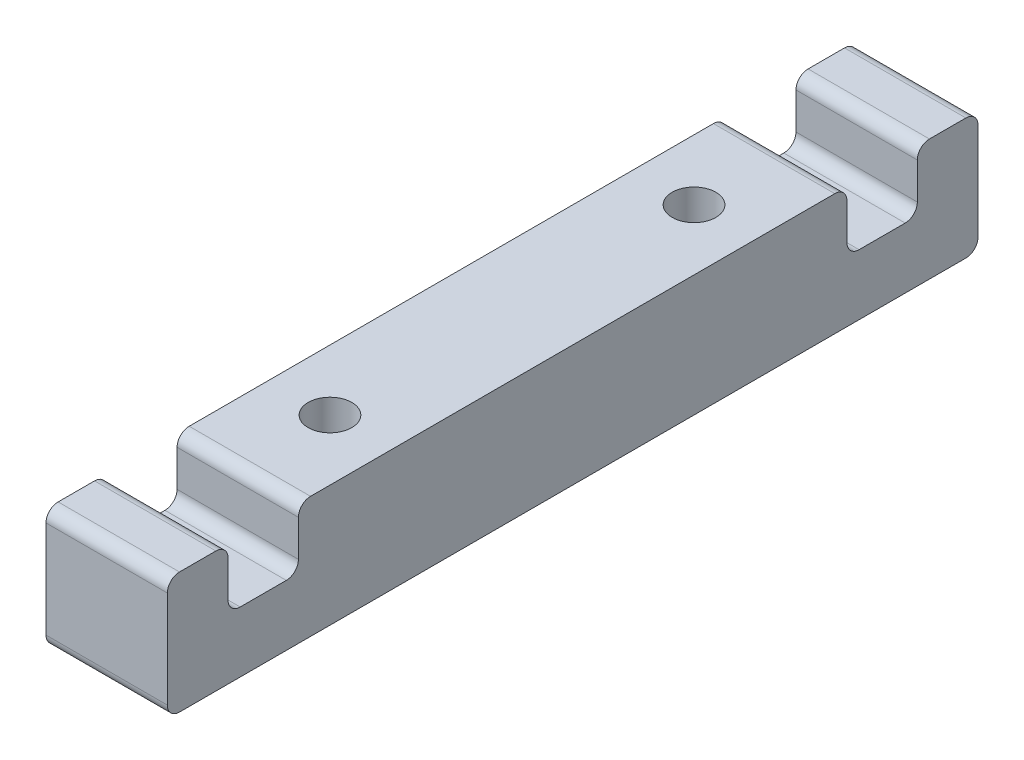
ISO-10303-21;
HEADER;
FILE_DESCRIPTION(('STEP AP214'),'2;1');
FILE_NAME('part.step','',(''),(''),'','','');
FILE_SCHEMA(('AUTOMOTIVE_DESIGN { 1 0 10303 214 1 1 1 1 }'));
ENDSEC;
DATA;
#1=APPLICATION_CONTEXT('core data for automotive mechanical design processes');
#2=APPLICATION_PROTOCOL_DEFINITION('international standard','automotive_design',2000,#1);
#3=PRODUCT_CONTEXT('',#1,'mechanical');
#4=PRODUCT('Part','Part','',(#3));
#5=PRODUCT_RELATED_PRODUCT_CATEGORY('part','',(#4));
#6=PRODUCT_DEFINITION_FORMATION('','',#4);
#7=PRODUCT_DEFINITION_CONTEXT('part definition',#1,'design');
#8=PRODUCT_DEFINITION('design','',#6,#7);
#9=PRODUCT_DEFINITION_SHAPE('','',#8);
#10=(LENGTH_UNIT() NAMED_UNIT(*) SI_UNIT(.MILLI.,.METRE.));
#11=(NAMED_UNIT(*) PLANE_ANGLE_UNIT() SI_UNIT($,.RADIAN.));
#12=(NAMED_UNIT(*) SI_UNIT($,.STERADIAN.) SOLID_ANGLE_UNIT());
#13=UNCERTAINTY_MEASURE_WITH_UNIT(LENGTH_MEASURE(1.E-05),#10,'distance_accuracy_value','');
#14=(GEOMETRIC_REPRESENTATION_CONTEXT(3) GLOBAL_UNCERTAINTY_ASSIGNED_CONTEXT((#13)) GLOBAL_UNIT_ASSIGNED_CONTEXT((#10,
#11,#12)) REPRESENTATION_CONTEXT('',''));
#15=CARTESIAN_POINT('',(0.,0.,0.));
#16=DIRECTION('',(0.,0.,1.));
#17=DIRECTION('',(1.,0.,0.));
#18=AXIS2_PLACEMENT_3D('',#15,#16,#17);
#19=CARTESIAN_POINT('',(12.7,0.,42.418));
#20=DIRECTION('',(0.,0.,-1.));
#21=DIRECTION('',(0.,1.,0.));
#22=AXIS2_PLACEMENT_3D('',#19,#20,#21);
#23=PLANE('',#22);
#24=DIRECTION('',(0.,-1.,0.));
#25=VECTOR('',#24,1.);
#26=CARTESIAN_POINT('',(12.7,0.,42.418));
#27=LINE('',#26,#25);
#28=CARTESIAN_POINT('',(12.7,11.43,42.418));
#29=VERTEX_POINT('',#28);
#30=CARTESIAN_POINT('',(12.7,1.26999999999999,42.418));
#31=VERTEX_POINT('',#30);
#32=EDGE_CURVE('E250',#29,#31,#27,.T.);
#33=ORIENTED_EDGE('',*,*,#32,.F.);
#34=DIRECTION('',(-1.,0.,0.));
#35=VECTOR('',#34,1.);
#36=CARTESIAN_POINT('',(12.7,11.43,42.418));
#37=LINE('',#36,#35);
#38=CARTESIAN_POINT('',(0.,11.43,42.418));
#39=VERTEX_POINT('',#38);
#40=EDGE_CURVE('E350',#29,#39,#37,.T.);
#41=ORIENTED_EDGE('',*,*,#40,.T.);
#42=DIRECTION('',(0.,-1.,0.));
#43=VECTOR('',#42,1.);
#44=CARTESIAN_POINT('',(0.,0.,42.418));
#45=LINE('',#44,#43);
#46=CARTESIAN_POINT('',(0.,1.26999999999999,42.418));
#47=VERTEX_POINT('',#46);
#48=EDGE_CURVE('E441',#39,#47,#45,.T.);
#49=ORIENTED_EDGE('',*,*,#48,.T.);
#50=DIRECTION('',(-1.,0.,0.));
#51=VECTOR('',#50,1.);
#52=CARTESIAN_POINT('',(12.7,1.26999999999999,42.418));
#53=LINE('',#52,#51);
#54=EDGE_CURVE('E347',#47,#31,#53,.F.);
#55=ORIENTED_EDGE('',*,*,#54,.T.);
#56=EDGE_LOOP('',(#33,#41,#49,#55));
#57=FACE_BOUND('',#56,.T.);
#58=ADVANCED_FACE('F42',(#57),#23,.F.);
#59=CARTESIAN_POINT('',(12.7,0.,-42.418));
#60=DIRECTION('',(0.,1.,0.));
#61=DIRECTION('',(0.,0.,1.));
#62=AXIS2_PLACEMENT_3D('',#59,#60,#61);
#63=PLANE('',#62);
#64=CARTESIAN_POINT('',(6.35,0.,19.05));
#65=DIRECTION('',(0.,1.,0.));
#66=DIRECTION('',(0.,0.,1.));
#67=AXIS2_PLACEMENT_3D('',#64,#65,#66);
#68=CIRCLE('',#67,2.286);
#69=CARTESIAN_POINT('',(6.35,0.,21.336));
#70=VERTEX_POINT('',#69);
#71=EDGE_CURVE('E446',#70,#70,#68,.T.);
#72=ORIENTED_EDGE('',*,*,#71,.T.);
#73=EDGE_LOOP('',(#72));
#74=FACE_BOUND('',#73,.T.);
#75=CARTESIAN_POINT('',(6.34999999999997,0.,-19.05));
#76=DIRECTION('',(0.,1.,0.));
#77=DIRECTION('',(0.,0.,-1.));
#78=AXIS2_PLACEMENT_3D('',#75,#76,#77);
#79=CIRCLE('',#78,2.286);
#80=CARTESIAN_POINT('',(6.34999999999997,0.,-16.764));
#81=VERTEX_POINT('',#80);
#82=EDGE_CURVE('E565',#81,#81,#79,.T.);
#83=ORIENTED_EDGE('',*,*,#82,.T.);
#84=EDGE_LOOP('',(#83));
#85=FACE_BOUND('',#84,.T.);
#86=DIRECTION('',(0.,0.,-1.));
#87=VECTOR('',#86,1.);
#88=CARTESIAN_POINT('',(12.7,0.,-42.418));
#89=LINE('',#88,#87);
#90=CARTESIAN_POINT('',(12.7,0.,41.148));
#91=VERTEX_POINT('',#90);
#92=CARTESIAN_POINT('',(12.7,0.,-41.148));
#93=VERTEX_POINT('',#92);
#94=EDGE_CURVE('E556',#91,#93,#89,.T.);
#95=ORIENTED_EDGE('',*,*,#94,.F.);
#96=DIRECTION('',(-1.,0.,0.));
#97=VECTOR('',#96,1.);
#98=CARTESIAN_POINT('',(12.7,0.,41.148));
#99=LINE('',#98,#97);
#100=CARTESIAN_POINT('',(0.,0.,41.148));
#101=VERTEX_POINT('',#100);
#102=EDGE_CURVE('E357',#91,#101,#99,.T.);
#103=ORIENTED_EDGE('',*,*,#102,.T.);
#104=DIRECTION('',(0.,0.,-1.));
#105=VECTOR('',#104,1.);
#106=CARTESIAN_POINT('',(0.,0.,-42.418));
#107=LINE('',#106,#105);
#108=CARTESIAN_POINT('',(0.,0.,-41.148));
#109=VERTEX_POINT('',#108);
#110=EDGE_CURVE('E445',#101,#109,#107,.T.);
#111=ORIENTED_EDGE('',*,*,#110,.T.);
#112=DIRECTION('',(-1.,0.,0.));
#113=VECTOR('',#112,1.);
#114=CARTESIAN_POINT('',(12.7,0.,-41.148));
#115=LINE('',#114,#113);
#116=EDGE_CURVE('E354',#109,#93,#115,.F.);
#117=ORIENTED_EDGE('',*,*,#116,.T.);
#118=EDGE_LOOP('',(#95,#103,#111,#117));
#119=FACE_BOUND('',#118,.T.);
#120=ADVANCED_FACE('F488',(#74,#85,#119),#63,.F.);
#121=CARTESIAN_POINT('',(12.7,0.,-42.418));
#122=DIRECTION('',(0.,0.,1.));
#123=DIRECTION('',(0.,-1.,0.));
#124=AXIS2_PLACEMENT_3D('',#121,#122,#123);
#125=PLANE('',#124);
#126=DIRECTION('',(0.,1.,0.));
#127=VECTOR('',#126,1.);
#128=CARTESIAN_POINT('',(12.7,0.,-42.418));
#129=LINE('',#128,#127);
#130=CARTESIAN_POINT('',(12.7,1.27,-42.418));
#131=VERTEX_POINT('',#130);
#132=CARTESIAN_POINT('',(12.7,11.43,-42.418));
#133=VERTEX_POINT('',#132);
#134=EDGE_CURVE('E549',#131,#133,#129,.T.);
#135=ORIENTED_EDGE('',*,*,#134,.F.);
#136=DIRECTION('',(-1.,0.,0.));
#137=VECTOR('',#136,1.);
#138=CARTESIAN_POINT('',(12.7,1.27,-42.418));
#139=LINE('',#138,#137);
#140=CARTESIAN_POINT('',(0.,1.27,-42.418));
#141=VERTEX_POINT('',#140);
#142=EDGE_CURVE('E364',#131,#141,#139,.T.);
#143=ORIENTED_EDGE('',*,*,#142,.T.);
#144=DIRECTION('',(0.,1.,0.));
#145=VECTOR('',#144,1.);
#146=CARTESIAN_POINT('',(0.,0.,-42.418));
#147=LINE('',#146,#145);
#148=CARTESIAN_POINT('',(0.,11.43,-42.418));
#149=VERTEX_POINT('',#148);
#150=EDGE_CURVE('E450',#141,#149,#147,.T.);
#151=ORIENTED_EDGE('',*,*,#150,.T.);
#152=DIRECTION('',(-1.,0.,0.));
#153=VECTOR('',#152,1.);
#154=CARTESIAN_POINT('',(12.7,11.43,-42.418));
#155=LINE('',#154,#153);
#156=EDGE_CURVE('E361',#149,#133,#155,.F.);
#157=ORIENTED_EDGE('',*,*,#156,.T.);
#158=EDGE_LOOP('',(#135,#143,#151,#157));
#159=FACE_BOUND('',#158,.T.);
#160=ADVANCED_FACE('F494',(#159),#125,.F.);
#161=CARTESIAN_POINT('',(12.7,12.7,-42.418));
#162=DIRECTION('',(0.,-1.,0.));
#163=DIRECTION('',(0.,0.,-1.));
#164=AXIS2_PLACEMENT_3D('',#161,#162,#163);
#165=PLANE('',#164);
#166=DIRECTION('',(0.,0.,1.));
#167=VECTOR('',#166,1.);
#168=CARTESIAN_POINT('',(12.7,12.7,-42.418));
#169=LINE('',#168,#167);
#170=CARTESIAN_POINT('',(12.7,12.7,-41.148));
#171=VERTEX_POINT('',#170);
#172=CARTESIAN_POINT('',(12.7,12.7,-37.338));
#173=VERTEX_POINT('',#172);
#174=EDGE_CURVE('E423',#171,#173,#169,.T.);
#175=ORIENTED_EDGE('',*,*,#174,.F.);
#176=DIRECTION('',(-1.,0.,0.));
#177=VECTOR('',#176,1.);
#178=CARTESIAN_POINT('',(12.7,12.7,-41.148));
#179=LINE('',#178,#177);
#180=CARTESIAN_POINT('',(0.,12.7,-41.148));
#181=VERTEX_POINT('',#180);
#182=EDGE_CURVE('E217',#171,#181,#179,.T.);
#183=ORIENTED_EDGE('',*,*,#182,.T.);
#184=DIRECTION('',(0.,0.,1.));
#185=VECTOR('',#184,1.);
#186=CARTESIAN_POINT('',(0.,12.7,-42.418));
#187=LINE('',#186,#185);
#188=CARTESIAN_POINT('',(0.,12.7,-37.338));
#189=VERTEX_POINT('',#188);
#190=EDGE_CURVE('E402',#181,#189,#187,.T.);
#191=ORIENTED_EDGE('',*,*,#190,.T.);
#192=DIRECTION('',(-1.,0.,0.));
#193=VECTOR('',#192,1.);
#194=CARTESIAN_POINT('',(12.7,12.7,-37.338));
#195=LINE('',#194,#193);
#196=EDGE_CURVE('E368',#189,#173,#195,.F.);
#197=ORIENTED_EDGE('',*,*,#196,.T.);
#198=EDGE_LOOP('',(#175,#183,#191,#197));
#199=FACE_BOUND('',#198,.T.);
#200=ADVANCED_FACE('F551',(#199),#165,.F.);
#201=CARTESIAN_POINT('',(12.7,12.7,-36.068));
#202=DIRECTION('',(0.,0.,-1.));
#203=DIRECTION('',(0.,1.,0.));
#204=AXIS2_PLACEMENT_3D('',#201,#202,#203);
#205=PLANE('',#204);
#206=DIRECTION('',(0.,-1.,0.));
#207=VECTOR('',#206,1.);
#208=CARTESIAN_POINT('',(0.,12.7,-36.068));
#209=LINE('',#208,#207);
#210=CARTESIAN_POINT('',(0.,11.43,-36.068));
#211=VERTEX_POINT('',#210);
#212=CARTESIAN_POINT('',(0.,7.62,-36.068));
#213=VERTEX_POINT('',#212);
#214=EDGE_CURVE('E390',#211,#213,#209,.T.);
#215=ORIENTED_EDGE('',*,*,#214,.T.);
#216=DIRECTION('',(-1.,0.,0.));
#217=VECTOR('',#216,1.);
#218=CARTESIAN_POINT('',(12.7,7.62,-36.068));
#219=LINE('',#218,#217);
#220=CARTESIAN_POINT('',(12.7,7.62,-36.068));
#221=VERTEX_POINT('',#220);
#222=EDGE_CURVE('E284',#213,#221,#219,.F.);
#223=ORIENTED_EDGE('',*,*,#222,.T.);
#224=DIRECTION('',(0.,-1.,0.));
#225=VECTOR('',#224,1.);
#226=CARTESIAN_POINT('',(12.7,12.7,-36.068));
#227=LINE('',#226,#225);
#228=CARTESIAN_POINT('',(12.7,11.43,-36.068));
#229=VERTEX_POINT('',#228);
#230=EDGE_CURVE('E412',#229,#221,#227,.T.);
#231=ORIENTED_EDGE('',*,*,#230,.F.);
#232=DIRECTION('',(-1.,0.,0.));
#233=VECTOR('',#232,1.);
#234=CARTESIAN_POINT('',(12.7,11.43,-36.068));
#235=LINE('',#234,#233);
#236=EDGE_CURVE('E280',#229,#211,#235,.T.);
#237=ORIENTED_EDGE('',*,*,#236,.T.);
#238=EDGE_LOOP('',(#215,#223,#231,#237));
#239=FACE_BOUND('',#238,.T.);
#240=ADVANCED_FACE('F397',(#239),#205,.F.);
#241=CARTESIAN_POINT('',(12.7,6.35,-36.068));
#242=DIRECTION('',(0.,-1.,0.));
#243=DIRECTION('',(0.,0.,-1.));
#244=AXIS2_PLACEMENT_3D('',#241,#242,#243);
#245=PLANE('',#244);
#246=DIRECTION('',(0.,0.,1.));
#247=VECTOR('',#246,1.);
#248=CARTESIAN_POINT('',(0.,6.35,-36.068));
#249=LINE('',#248,#247);
#250=CARTESIAN_POINT('',(0.,6.35,-34.798));
#251=VERTEX_POINT('',#250);
#252=CARTESIAN_POINT('',(0.,6.35,-29.972));
#253=VERTEX_POINT('',#252);
#254=EDGE_CURVE('E392',#251,#253,#249,.T.);
#255=ORIENTED_EDGE('',*,*,#254,.T.);
#256=DIRECTION('',(-1.,0.,0.));
#257=VECTOR('',#256,1.);
#258=CARTESIAN_POINT('',(12.7,6.35,-29.972));
#259=LINE('',#258,#257);
#260=CARTESIAN_POINT('',(12.7,6.35,-29.972));
#261=VERTEX_POINT('',#260);
#262=EDGE_CURVE('E277',#253,#261,#259,.F.);
#263=ORIENTED_EDGE('',*,*,#262,.T.);
#264=DIRECTION('',(0.,0.,1.));
#265=VECTOR('',#264,1.);
#266=CARTESIAN_POINT('',(12.7,6.35,-36.068));
#267=LINE('',#266,#265);
#268=CARTESIAN_POINT('',(12.7,6.35,-34.798));
#269=VERTEX_POINT('',#268);
#270=EDGE_CURVE('E410',#269,#261,#267,.T.);
#271=ORIENTED_EDGE('',*,*,#270,.F.);
#272=DIRECTION('',(-1.,0.,0.));
#273=VECTOR('',#272,1.);
#274=CARTESIAN_POINT('',(0.,6.35,-34.798));
#275=LINE('',#274,#273);
#276=EDGE_CURVE('E273',#269,#251,#275,.T.);
#277=ORIENTED_EDGE('',*,*,#276,.T.);
#278=EDGE_LOOP('',(#255,#263,#271,#277));
#279=FACE_BOUND('',#278,.T.);
#280=ADVANCED_FACE('F414',(#279),#245,.F.);
#281=CARTESIAN_POINT('',(12.7,6.35,-28.702));
#282=DIRECTION('',(0.,0.,1.));
#283=DIRECTION('',(0.,-1.,0.));
#284=AXIS2_PLACEMENT_3D('',#281,#282,#283);
#285=PLANE('',#284);
#286=DIRECTION('',(0.,1.,0.));
#287=VECTOR('',#286,1.);
#288=CARTESIAN_POINT('',(12.7,6.35,-28.702));
#289=LINE('',#288,#287);
#290=CARTESIAN_POINT('',(12.7,7.62,-28.702));
#291=VERTEX_POINT('',#290);
#292=CARTESIAN_POINT('',(12.7,11.43,-28.702));
#293=VERTEX_POINT('',#292);
#294=EDGE_CURVE('E417',#291,#293,#289,.T.);
#295=ORIENTED_EDGE('',*,*,#294,.F.);
#296=DIRECTION('',(-1.,0.,0.));
#297=VECTOR('',#296,1.);
#298=CARTESIAN_POINT('',(0.,7.62,-28.702));
#299=LINE('',#298,#297);
#300=CARTESIAN_POINT('',(0.,7.62,-28.702));
#301=VERTEX_POINT('',#300);
#302=EDGE_CURVE('E269',#291,#301,#299,.T.);
#303=ORIENTED_EDGE('',*,*,#302,.T.);
#304=DIRECTION('',(0.,1.,0.));
#305=VECTOR('',#304,1.);
#306=CARTESIAN_POINT('',(0.,6.35,-28.702));
#307=LINE('',#306,#305);
#308=CARTESIAN_POINT('',(0.,11.43,-28.702));
#309=VERTEX_POINT('',#308);
#310=EDGE_CURVE('E459',#301,#309,#307,.T.);
#311=ORIENTED_EDGE('',*,*,#310,.T.);
#312=DIRECTION('',(-1.,0.,0.));
#313=VECTOR('',#312,1.);
#314=CARTESIAN_POINT('',(12.7,11.43,-28.702));
#315=LINE('',#314,#313);
#316=EDGE_CURVE('E266',#309,#293,#315,.F.);
#317=ORIENTED_EDGE('',*,*,#316,.T.);
#318=EDGE_LOOP('',(#295,#303,#311,#317));
#319=FACE_BOUND('',#318,.T.);
#320=ADVANCED_FACE('F484',(#319),#285,.F.);
#321=CARTESIAN_POINT('',(12.7,12.7,28.702));
#322=DIRECTION('',(0.,-1.,0.));
#323=DIRECTION('',(0.,0.,-1.));
#324=AXIS2_PLACEMENT_3D('',#321,#322,#323);
#325=PLANE('',#324);
#326=CARTESIAN_POINT('',(6.35,12.7,19.05));
#327=DIRECTION('',(0.,1.,0.));
#328=DIRECTION('',(0.,0.,1.));
#329=AXIS2_PLACEMENT_3D('',#326,#327,#328);
#330=CIRCLE('',#329,2.286);
#331=CARTESIAN_POINT('',(6.35,12.7,21.336));
#332=VERTEX_POINT('',#331);
#333=EDGE_CURVE('E573',#332,#332,#330,.T.);
#334=ORIENTED_EDGE('',*,*,#333,.F.);
#335=EDGE_LOOP('',(#334));
#336=FACE_BOUND('',#335,.T.);
#337=CARTESIAN_POINT('',(6.34999999999997,12.7,-19.05));
#338=DIRECTION('',(0.,1.,0.));
#339=DIRECTION('',(0.,0.,-1.));
#340=AXIS2_PLACEMENT_3D('',#337,#338,#339);
#341=CIRCLE('',#340,2.286);
#342=CARTESIAN_POINT('',(6.34999999999997,12.7,-16.764));
#343=VERTEX_POINT('',#342);
#344=EDGE_CURVE('E569',#343,#343,#341,.T.);
#345=ORIENTED_EDGE('',*,*,#344,.F.);
#346=EDGE_LOOP('',(#345));
#347=FACE_BOUND('',#346,.T.);
#348=DIRECTION('',(0.,0.,1.));
#349=VECTOR('',#348,1.);
#350=CARTESIAN_POINT('',(12.7,12.7,28.702));
#351=LINE('',#350,#349);
#352=CARTESIAN_POINT('',(12.7,12.7,-27.432));
#353=VERTEX_POINT('',#352);
#354=CARTESIAN_POINT('',(12.7,12.7,27.432));
#355=VERTEX_POINT('',#354);
#356=EDGE_CURVE('E421',#353,#355,#351,.T.);
#357=ORIENTED_EDGE('',*,*,#356,.F.);
#358=DIRECTION('',(-1.,0.,0.));
#359=VECTOR('',#358,1.);
#360=CARTESIAN_POINT('',(12.7,12.7,-27.432));
#361=LINE('',#360,#359);
#362=CARTESIAN_POINT('',(0.,12.7,-27.432));
#363=VERTEX_POINT('',#362);
#364=EDGE_CURVE('E290',#353,#363,#361,.T.);
#365=ORIENTED_EDGE('',*,*,#364,.T.);
#366=DIRECTION('',(0.,0.,1.));
#367=VECTOR('',#366,1.);
#368=CARTESIAN_POINT('',(0.,12.7,28.702));
#369=LINE('',#368,#367);
#370=CARTESIAN_POINT('',(0.,12.7,27.432));
#371=VERTEX_POINT('',#370);
#372=EDGE_CURVE('E244',#363,#371,#369,.T.);
#373=ORIENTED_EDGE('',*,*,#372,.T.);
#374=DIRECTION('',(-1.,0.,0.));
#375=VECTOR('',#374,1.);
#376=CARTESIAN_POINT('',(12.7,12.7,27.432));
#377=LINE('',#376,#375);
#378=EDGE_CURVE('E287',#371,#355,#377,.F.);
#379=ORIENTED_EDGE('',*,*,#378,.T.);
#380=EDGE_LOOP('',(#357,#365,#373,#379));
#381=FACE_BOUND('',#380,.T.);
#382=ADVANCED_FACE('F467',(#336,#347,#381),#325,.F.);
#383=CARTESIAN_POINT('',(12.7,6.34999999999999,28.702));
#384=DIRECTION('',(0.,0.,-1.));
#385=DIRECTION('',(0.,1.,0.));
#386=AXIS2_PLACEMENT_3D('',#383,#384,#385);
#387=PLANE('',#386);
#388=DIRECTION('',(0.,-1.,0.));
#389=VECTOR('',#388,1.);
#390=CARTESIAN_POINT('',(0.,6.34999999999999,28.702));
#391=LINE('',#390,#389);
#392=CARTESIAN_POINT('',(0.,11.43,28.702));
#393=VERTEX_POINT('',#392);
#394=CARTESIAN_POINT('',(0.,7.61999999999999,28.702));
#395=VERTEX_POINT('',#394);
#396=EDGE_CURVE('E237',#393,#395,#391,.T.);
#397=ORIENTED_EDGE('',*,*,#396,.T.);
#398=DIRECTION('',(-1.,0.,0.));
#399=VECTOR('',#398,1.);
#400=CARTESIAN_POINT('',(12.7,7.61999999999999,28.702));
#401=LINE('',#400,#399);
#402=CARTESIAN_POINT('',(12.7,7.61999999999999,28.702));
#403=VERTEX_POINT('',#402);
#404=EDGE_CURVE('E210',#395,#403,#401,.F.);
#405=ORIENTED_EDGE('',*,*,#404,.T.);
#406=DIRECTION('',(0.,-1.,0.));
#407=VECTOR('',#406,1.);
#408=CARTESIAN_POINT('',(12.7,6.34999999999999,28.702));
#409=LINE('',#408,#407);
#410=CARTESIAN_POINT('',(12.7,11.43,28.702));
#411=VERTEX_POINT('',#410);
#412=EDGE_CURVE('E430',#411,#403,#409,.T.);
#413=ORIENTED_EDGE('',*,*,#412,.F.);
#414=DIRECTION('',(-1.,0.,0.));
#415=VECTOR('',#414,1.);
#416=CARTESIAN_POINT('',(12.7,11.43,28.702));
#417=LINE('',#416,#415);
#418=EDGE_CURVE('E228',#411,#393,#417,.T.);
#419=ORIENTED_EDGE('',*,*,#418,.T.);
#420=EDGE_LOOP('',(#397,#405,#413,#419));
#421=FACE_BOUND('',#420,.T.);
#422=ADVANCED_FACE('F475',(#421),#387,.F.);
#423=CARTESIAN_POINT('',(12.7,6.34999999999999,36.068));
#424=DIRECTION('',(0.,-1.,0.));
#425=DIRECTION('',(0.,0.,-1.));
#426=AXIS2_PLACEMENT_3D('',#423,#424,#425);
#427=PLANE('',#426);
#428=DIRECTION('',(0.,0.,1.));
#429=VECTOR('',#428,1.);
#430=CARTESIAN_POINT('',(12.7,6.34999999999999,36.068));
#431=LINE('',#430,#429);
#432=CARTESIAN_POINT('',(12.7,6.34999999999999,29.972));
#433=VERTEX_POINT('',#432);
#434=CARTESIAN_POINT('',(12.7,6.34999999999999,34.798));
#435=VERTEX_POINT('',#434);
#436=EDGE_CURVE('E226',#433,#435,#431,.T.);
#437=ORIENTED_EDGE('',*,*,#436,.F.);
#438=DIRECTION('',(-1.,0.,0.));
#439=VECTOR('',#438,1.);
#440=CARTESIAN_POINT('',(0.,6.34999999999999,29.972));
#441=LINE('',#440,#439);
#442=CARTESIAN_POINT('',(0.,6.34999999999999,29.972));
#443=VERTEX_POINT('',#442);
#444=EDGE_CURVE('E209',#433,#443,#441,.T.);
#445=ORIENTED_EDGE('',*,*,#444,.T.);
#446=DIRECTION('',(0.,0.,1.));
#447=VECTOR('',#446,1.);
#448=CARTESIAN_POINT('',(0.,6.34999999999999,36.068));
#449=LINE('',#448,#447);
#450=CARTESIAN_POINT('',(0.,6.34999999999999,34.798));
#451=VERTEX_POINT('',#450);
#452=EDGE_CURVE('E223',#443,#451,#449,.T.);
#453=ORIENTED_EDGE('',*,*,#452,.T.);
#454=DIRECTION('',(-1.,0.,0.));
#455=VECTOR('',#454,1.);
#456=CARTESIAN_POINT('',(12.7,6.34999999999999,34.798));
#457=LINE('',#456,#455);
#458=EDGE_CURVE('E229',#451,#435,#457,.F.);
#459=ORIENTED_EDGE('',*,*,#458,.T.);
#460=EDGE_LOOP('',(#437,#445,#453,#459));
#461=FACE_BOUND('',#460,.T.);
#462=ADVANCED_FACE('F222',(#461),#427,.F.);
#463=CARTESIAN_POINT('',(12.7,12.7,36.068));
#464=DIRECTION('',(0.,0.,1.));
#465=DIRECTION('',(0.,-1.,0.));
#466=AXIS2_PLACEMENT_3D('',#463,#464,#465);
#467=PLANE('',#466);
#468=DIRECTION('',(0.,1.,0.));
#469=VECTOR('',#468,1.);
#470=CARTESIAN_POINT('',(12.7,12.7,36.068));
#471=LINE('',#470,#469);
#472=CARTESIAN_POINT('',(12.7,7.61999999999999,36.068));
#473=VERTEX_POINT('',#472);
#474=CARTESIAN_POINT('',(12.7,11.43,36.068));
#475=VERTEX_POINT('',#474);
#476=EDGE_CURVE('E436',#473,#475,#471,.T.);
#477=ORIENTED_EDGE('',*,*,#476,.F.);
#478=DIRECTION('',(-1.,0.,0.));
#479=VECTOR('',#478,1.);
#480=CARTESIAN_POINT('',(0.,7.61999999999999,36.068));
#481=LINE('',#480,#479);
#482=CARTESIAN_POINT('',(0.,7.61999999999999,36.068));
#483=VERTEX_POINT('',#482);
#484=EDGE_CURVE('E262',#473,#483,#481,.T.);
#485=ORIENTED_EDGE('',*,*,#484,.T.);
#486=DIRECTION('',(0.,1.,0.));
#487=VECTOR('',#486,1.);
#488=CARTESIAN_POINT('',(0.,12.7,36.068));
#489=LINE('',#488,#487);
#490=CARTESIAN_POINT('',(0.,11.43,36.068));
#491=VERTEX_POINT('',#490);
#492=EDGE_CURVE('E236',#483,#491,#489,.T.);
#493=ORIENTED_EDGE('',*,*,#492,.T.);
#494=DIRECTION('',(-1.,0.,0.));
#495=VECTOR('',#494,1.);
#496=CARTESIAN_POINT('',(12.7,11.43,36.068));
#497=LINE('',#496,#495);
#498=EDGE_CURVE('E259',#491,#475,#497,.F.);
#499=ORIENTED_EDGE('',*,*,#498,.T.);
#500=EDGE_LOOP('',(#477,#485,#493,#499));
#501=FACE_BOUND('',#500,.T.);
#502=ADVANCED_FACE('F482',(#501),#467,.F.);
#503=CARTESIAN_POINT('',(12.7,12.7,42.418));
#504=DIRECTION('',(0.,-1.,0.));
#505=DIRECTION('',(0.,0.,-1.));
#506=AXIS2_PLACEMENT_3D('',#503,#504,#505);
#507=PLANE('',#506);
#508=DIRECTION('',(0.,0.,1.));
#509=VECTOR('',#508,1.);
#510=CARTESIAN_POINT('',(12.7,12.7,42.418));
#511=LINE('',#510,#509);
#512=CARTESIAN_POINT('',(12.7,12.7,37.338));
#513=VERTEX_POINT('',#512);
#514=CARTESIAN_POINT('',(12.7,12.7,41.148));
#515=VERTEX_POINT('',#514);
#516=EDGE_CURVE('E252',#513,#515,#511,.T.);
#517=ORIENTED_EDGE('',*,*,#516,.F.);
#518=DIRECTION('',(-1.,0.,0.));
#519=VECTOR('',#518,1.);
#520=CARTESIAN_POINT('',(12.7,12.7,37.338));
#521=LINE('',#520,#519);
#522=CARTESIAN_POINT('',(0.,12.7,37.338));
#523=VERTEX_POINT('',#522);
#524=EDGE_CURVE('E343',#513,#523,#521,.T.);
#525=ORIENTED_EDGE('',*,*,#524,.T.);
#526=DIRECTION('',(0.,0.,1.));
#527=VECTOR('',#526,1.);
#528=CARTESIAN_POINT('',(0.,12.7,42.418));
#529=LINE('',#528,#527);
#530=CARTESIAN_POINT('',(0.,12.7,41.148));
#531=VERTEX_POINT('',#530);
#532=EDGE_CURVE('E242',#523,#531,#529,.T.);
#533=ORIENTED_EDGE('',*,*,#532,.T.);
#534=DIRECTION('',(-1.,0.,0.));
#535=VECTOR('',#534,1.);
#536=CARTESIAN_POINT('',(12.7,12.7,41.148));
#537=LINE('',#536,#535);
#538=EDGE_CURVE('E58',#531,#515,#537,.F.);
#539=ORIENTED_EDGE('',*,*,#538,.T.);
#540=EDGE_LOOP('',(#517,#525,#533,#539));
#541=FACE_BOUND('',#540,.T.);
#542=ADVANCED_FACE('F600',(#541),#507,.F.);
#543=CARTESIAN_POINT('',(12.7,0.,0.));
#544=DIRECTION('',(-1.,0.,0.));
#545=DIRECTION('',(0.,0.,1.));
#546=AXIS2_PLACEMENT_3D('',#543,#544,#545);
#547=PLANE('',#546);
#548=ORIENTED_EDGE('',*,*,#294,.T.);
#549=CARTESIAN_POINT('',(12.7,11.43,-27.432));
#550=DIRECTION('',(-1.,0.,0.));
#551=DIRECTION('',(0.,0.,1.));
#552=AXIS2_PLACEMENT_3D('',#549,#550,#551);
#553=CIRCLE('',#552,1.27);
#554=EDGE_CURVE('E338',#293,#353,#553,.F.);
#555=ORIENTED_EDGE('',*,*,#554,.T.);
#556=ORIENTED_EDGE('',*,*,#356,.T.);
#557=CARTESIAN_POINT('',(12.7,11.43,27.432));
#558=DIRECTION('',(-1.,0.,0.));
#559=DIRECTION('',(0.,0.,1.));
#560=AXIS2_PLACEMENT_3D('',#557,#558,#559);
#561=CIRCLE('',#560,1.27);
#562=EDGE_CURVE('E335',#355,#411,#561,.F.);
#563=ORIENTED_EDGE('',*,*,#562,.T.);
#564=ORIENTED_EDGE('',*,*,#412,.T.);
#565=CARTESIAN_POINT('',(12.7,7.61999999999999,29.972));
#566=DIRECTION('',(-1.,0.,0.));
#567=DIRECTION('',(0.,0.,1.));
#568=AXIS2_PLACEMENT_3D('',#565,#566,#567);
#569=CIRCLE('',#568,1.27);
#570=EDGE_CURVE('E216',#403,#433,#569,.T.);
#571=ORIENTED_EDGE('',*,*,#570,.T.);
#572=ORIENTED_EDGE('',*,*,#436,.T.);
#573=CARTESIAN_POINT('',(12.7,7.61999999999999,34.798));
#574=DIRECTION('',(-1.,0.,0.));
#575=DIRECTION('',(0.,0.,1.));
#576=AXIS2_PLACEMENT_3D('',#573,#574,#575);
#577=CIRCLE('',#576,1.27);
#578=EDGE_CURVE('E378',#435,#473,#577,.T.);
#579=ORIENTED_EDGE('',*,*,#578,.T.);
#580=ORIENTED_EDGE('',*,*,#476,.T.);
#581=CARTESIAN_POINT('',(12.7,11.43,37.338));
#582=DIRECTION('',(-1.,0.,0.));
#583=DIRECTION('',(0.,0.,1.));
#584=AXIS2_PLACEMENT_3D('',#581,#582,#583);
#585=CIRCLE('',#584,1.27);
#586=EDGE_CURVE('E65',#475,#513,#585,.F.);
#587=ORIENTED_EDGE('',*,*,#586,.T.);
#588=ORIENTED_EDGE('',*,*,#516,.T.);
#589=CARTESIAN_POINT('',(12.7,11.43,41.148));
#590=DIRECTION('',(-1.,0.,0.));
#591=DIRECTION('',(0.,0.,1.));
#592=AXIS2_PLACEMENT_3D('',#589,#590,#591);
#593=CIRCLE('',#592,1.27);
#594=EDGE_CURVE('E330',#515,#29,#593,.F.);
#595=ORIENTED_EDGE('',*,*,#594,.T.);
#596=ORIENTED_EDGE('',*,*,#32,.T.);
#597=CARTESIAN_POINT('',(12.7,1.26999999999999,41.148));
#598=DIRECTION('',(-1.,0.,0.));
#599=DIRECTION('',(0.,0.,1.));
#600=AXIS2_PLACEMENT_3D('',#597,#598,#599);
#601=CIRCLE('',#600,1.27);
#602=EDGE_CURVE('E327',#31,#91,#601,.F.);
#603=ORIENTED_EDGE('',*,*,#602,.T.);
#604=ORIENTED_EDGE('',*,*,#94,.T.);
#605=CARTESIAN_POINT('',(12.7,1.27,-41.148));
#606=DIRECTION('',(-1.,0.,0.));
#607=DIRECTION('',(0.,0.,1.));
#608=AXIS2_PLACEMENT_3D('',#605,#606,#607);
#609=CIRCLE('',#608,1.27);
#610=EDGE_CURVE('E324',#93,#131,#609,.F.);
#611=ORIENTED_EDGE('',*,*,#610,.T.);
#612=ORIENTED_EDGE('',*,*,#134,.T.);
#613=CARTESIAN_POINT('',(12.7,11.43,-41.148));
#614=DIRECTION('',(-1.,0.,0.));
#615=DIRECTION('',(0.,0.,1.));
#616=AXIS2_PLACEMENT_3D('',#613,#614,#615);
#617=CIRCLE('',#616,1.27);
#618=EDGE_CURVE('E321',#133,#171,#617,.F.);
#619=ORIENTED_EDGE('',*,*,#618,.T.);
#620=ORIENTED_EDGE('',*,*,#174,.T.);
#621=CARTESIAN_POINT('',(12.7,11.43,-37.338));
#622=DIRECTION('',(-1.,0.,0.));
#623=DIRECTION('',(0.,0.,1.));
#624=AXIS2_PLACEMENT_3D('',#621,#622,#623);
#625=CIRCLE('',#624,1.27);
#626=EDGE_CURVE('E318',#173,#229,#625,.F.);
#627=ORIENTED_EDGE('',*,*,#626,.T.);
#628=ORIENTED_EDGE('',*,*,#230,.T.);
#629=CARTESIAN_POINT('',(12.7,7.62,-34.798));
#630=DIRECTION('',(-1.,0.,0.));
#631=DIRECTION('',(0.,0.,1.));
#632=AXIS2_PLACEMENT_3D('',#629,#630,#631);
#633=CIRCLE('',#632,1.27);
#634=EDGE_CURVE('E11',#221,#269,#633,.T.);
#635=ORIENTED_EDGE('',*,*,#634,.T.);
#636=ORIENTED_EDGE('',*,*,#270,.T.);
#637=CARTESIAN_POINT('',(12.7,7.62,-29.972));
#638=DIRECTION('',(-1.,0.,0.));
#639=DIRECTION('',(0.,0.,1.));
#640=AXIS2_PLACEMENT_3D('',#637,#638,#639);
#641=CIRCLE('',#640,1.27);
#642=EDGE_CURVE('E384',#261,#291,#641,.T.);
#643=ORIENTED_EDGE('',*,*,#642,.T.);
#644=EDGE_LOOP('',(#548,#555,#556,#563,#564,#571,#572,#579,#580,#587,#588,#595,#596,#603,#604,
#611,#612,#619,#620,#627,#628,#635,#636,#643));
#645=FACE_BOUND('',#644,.T.);
#646=ADVANCED_FACE('F409',(#645),#547,.F.);
#647=CARTESIAN_POINT('',(0.,0.,0.));
#648=DIRECTION('',(-1.,0.,0.));
#649=DIRECTION('',(0.,0.,1.));
#650=AXIS2_PLACEMENT_3D('',#647,#648,#649);
#651=PLANE('',#650);
#652=ORIENTED_EDGE('',*,*,#372,.F.);
#653=CARTESIAN_POINT('',(0.,11.43,-27.432));
#654=DIRECTION('',(-1.,0.,0.));
#655=DIRECTION('',(0.,0.,1.));
#656=AXIS2_PLACEMENT_3D('',#653,#654,#655);
#657=CIRCLE('',#656,1.27);
#658=EDGE_CURVE('E315',#363,#309,#657,.T.);
#659=ORIENTED_EDGE('',*,*,#658,.T.);
#660=ORIENTED_EDGE('',*,*,#310,.F.);
#661=CARTESIAN_POINT('',(0.,7.62,-29.972));
#662=DIRECTION('',(-1.,0.,0.));
#663=DIRECTION('',(0.,0.,1.));
#664=AXIS2_PLACEMENT_3D('',#661,#662,#663);
#665=CIRCLE('',#664,1.27);
#666=EDGE_CURVE('E381',#301,#253,#665,.F.);
#667=ORIENTED_EDGE('',*,*,#666,.T.);
#668=ORIENTED_EDGE('',*,*,#254,.F.);
#669=CARTESIAN_POINT('',(0.,7.62,-34.798));
#670=DIRECTION('',(-1.,0.,0.));
#671=DIRECTION('',(0.,0.,1.));
#672=AXIS2_PLACEMENT_3D('',#669,#670,#671);
#673=CIRCLE('',#672,1.27);
#674=EDGE_CURVE('E51',#251,#213,#673,.F.);
#675=ORIENTED_EDGE('',*,*,#674,.T.);
#676=ORIENTED_EDGE('',*,*,#214,.F.);
#677=CARTESIAN_POINT('',(0.,11.43,-37.338));
#678=DIRECTION('',(-1.,0.,0.));
#679=DIRECTION('',(0.,0.,1.));
#680=AXIS2_PLACEMENT_3D('',#677,#678,#679);
#681=CIRCLE('',#680,1.27);
#682=EDGE_CURVE('E294',#211,#189,#681,.T.);
#683=ORIENTED_EDGE('',*,*,#682,.T.);
#684=ORIENTED_EDGE('',*,*,#190,.F.);
#685=CARTESIAN_POINT('',(0.,11.43,-41.148));
#686=DIRECTION('',(-1.,0.,0.));
#687=DIRECTION('',(0.,0.,1.));
#688=AXIS2_PLACEMENT_3D('',#685,#686,#687);
#689=CIRCLE('',#688,1.27);
#690=EDGE_CURVE('E297',#181,#149,#689,.T.);
#691=ORIENTED_EDGE('',*,*,#690,.T.);
#692=ORIENTED_EDGE('',*,*,#150,.F.);
#693=CARTESIAN_POINT('',(0.,1.27,-41.148));
#694=DIRECTION('',(-1.,0.,0.));
#695=DIRECTION('',(0.,0.,1.));
#696=AXIS2_PLACEMENT_3D('',#693,#694,#695);
#697=CIRCLE('',#696,1.27);
#698=EDGE_CURVE('E300',#141,#109,#697,.T.);
#699=ORIENTED_EDGE('',*,*,#698,.T.);
#700=ORIENTED_EDGE('',*,*,#110,.F.);
#701=CARTESIAN_POINT('',(0.,1.26999999999999,41.148));
#702=DIRECTION('',(-1.,0.,0.));
#703=DIRECTION('',(0.,0.,1.));
#704=AXIS2_PLACEMENT_3D('',#701,#702,#703);
#705=CIRCLE('',#704,1.27);
#706=EDGE_CURVE('E303',#101,#47,#705,.T.);
#707=ORIENTED_EDGE('',*,*,#706,.T.);
#708=ORIENTED_EDGE('',*,*,#48,.F.);
#709=CARTESIAN_POINT('',(0.,11.43,41.148));
#710=DIRECTION('',(-1.,0.,0.));
#711=DIRECTION('',(0.,0.,1.));
#712=AXIS2_PLACEMENT_3D('',#709,#710,#711);
#713=CIRCLE('',#712,1.27);
#714=EDGE_CURVE('E306',#39,#531,#713,.T.);
#715=ORIENTED_EDGE('',*,*,#714,.T.);
#716=ORIENTED_EDGE('',*,*,#532,.F.);
#717=CARTESIAN_POINT('',(0.,11.43,37.338));
#718=DIRECTION('',(-1.,0.,0.));
#719=DIRECTION('',(0.,0.,1.));
#720=AXIS2_PLACEMENT_3D('',#717,#718,#719);
#721=CIRCLE('',#720,1.27);
#722=EDGE_CURVE('E309',#523,#491,#721,.T.);
#723=ORIENTED_EDGE('',*,*,#722,.T.);
#724=ORIENTED_EDGE('',*,*,#492,.F.);
#725=CARTESIAN_POINT('',(0.,7.61999999999999,34.798));
#726=DIRECTION('',(-1.,0.,0.));
#727=DIRECTION('',(0.,0.,1.));
#728=AXIS2_PLACEMENT_3D('',#725,#726,#727);
#729=CIRCLE('',#728,1.27);
#730=EDGE_CURVE('E234',#483,#451,#729,.F.);
#731=ORIENTED_EDGE('',*,*,#730,.T.);
#732=ORIENTED_EDGE('',*,*,#452,.F.);
#733=CARTESIAN_POINT('',(0.,7.61999999999999,29.972));
#734=DIRECTION('',(-1.,0.,0.));
#735=DIRECTION('',(0.,0.,1.));
#736=AXIS2_PLACEMENT_3D('',#733,#734,#735);
#737=CIRCLE('',#736,1.27);
#738=EDGE_CURVE('E205',#443,#395,#737,.F.);
#739=ORIENTED_EDGE('',*,*,#738,.T.);
#740=ORIENTED_EDGE('',*,*,#396,.F.);
#741=CARTESIAN_POINT('',(0.,11.43,27.432));
#742=DIRECTION('',(-1.,0.,0.));
#743=DIRECTION('',(0.,0.,1.));
#744=AXIS2_PLACEMENT_3D('',#741,#742,#743);
#745=CIRCLE('',#744,1.27);
#746=EDGE_CURVE('E312',#393,#371,#745,.T.);
#747=ORIENTED_EDGE('',*,*,#746,.T.);
#748=EDGE_LOOP('',(#652,#659,#660,#667,#668,#675,#676,#683,#684,#691,#692,#699,#700,#707,#708,
#715,#716,#723,#724,#731,#732,#739,#740,#747));
#749=FACE_BOUND('',#748,.T.);
#750=ADVANCED_FACE('F232',(#749),#651,.T.);
#751=CARTESIAN_POINT('',(6.34999999999997,0.,-19.05));
#752=DIRECTION('',(0.,1.,0.));
#753=DIRECTION('',(0.,0.,1.));
#754=AXIS2_PLACEMENT_3D('',#751,#752,#753);
#755=CYLINDRICAL_SURFACE('',#754,2.286);
#756=CARTESIAN_POINT('',(6.34999999999997,0.,-16.764));
#757=CARTESIAN_POINT('',(6.34999999999997,0.132291666666663,-16.764));
#758=CARTESIAN_POINT('',(6.34999999999997,0.26458333333333,-16.764));
#759=CARTESIAN_POINT('',(6.34999999999997,0.529166666666663,-16.764));
#760=CARTESIAN_POINT('',(6.34999999999997,0.66145833333333,-16.764));
#761=CARTESIAN_POINT('',(6.34999999999997,0.926041666666663,-16.764));
#762=CARTESIAN_POINT('',(6.34999999999997,1.05833333333333,-16.764));
#763=CARTESIAN_POINT('',(6.34999999999997,1.32291666666666,-16.764));
#764=CARTESIAN_POINT('',(6.34999999999997,1.45520833333333,-16.764));
#765=CARTESIAN_POINT('',(6.34999999999997,1.71979166666666,-16.764));
#766=CARTESIAN_POINT('',(6.34999999999997,1.85208333333333,-16.764));
#767=CARTESIAN_POINT('',(6.34999999999997,2.11666666666666,-16.764));
#768=CARTESIAN_POINT('',(6.34999999999997,2.24895833333333,-16.764));
#769=CARTESIAN_POINT('',(6.34999999999997,2.51354166666666,-16.764));
#770=CARTESIAN_POINT('',(6.34999999999997,2.64583333333333,-16.764));
#771=CARTESIAN_POINT('',(6.34999999999997,2.91041666666666,-16.764));
#772=CARTESIAN_POINT('',(6.34999999999997,3.04270833333333,-16.764));
#773=CARTESIAN_POINT('',(6.34999999999997,3.30729166666666,-16.764));
#774=CARTESIAN_POINT('',(6.34999999999997,3.43958333333333,-16.764));
#775=CARTESIAN_POINT('',(6.34999999999997,3.70416666666666,-16.764));
#776=CARTESIAN_POINT('',(6.34999999999997,3.83645833333333,-16.764));
#777=CARTESIAN_POINT('',(6.34999999999997,4.10104166666666,-16.764));
#778=CARTESIAN_POINT('',(6.34999999999997,4.23333333333333,-16.764));
#779=CARTESIAN_POINT('',(6.34999999999997,4.49791666666666,-16.764));
#780=CARTESIAN_POINT('',(6.34999999999997,4.63020833333333,-16.764));
#781=CARTESIAN_POINT('',(6.34999999999997,4.89479166666666,-16.764));
#782=CARTESIAN_POINT('',(6.34999999999997,5.02708333333333,-16.764));
#783=CARTESIAN_POINT('',(6.34999999999997,5.29166666666666,-16.764));
#784=CARTESIAN_POINT('',(6.34999999999997,5.42395833333333,-16.764));
#785=CARTESIAN_POINT('',(6.34999999999997,5.68854166666666,-16.764));
#786=CARTESIAN_POINT('',(6.34999999999997,5.82083333333333,-16.764));
#787=CARTESIAN_POINT('',(6.34999999999997,6.08541666666666,-16.764));
#788=CARTESIAN_POINT('',(6.34999999999997,6.21770833333333,-16.764));
#789=CARTESIAN_POINT('',(6.34999999999997,6.48229166666666,-16.764));
#790=CARTESIAN_POINT('',(6.34999999999997,6.61458333333333,-16.764));
#791=CARTESIAN_POINT('',(6.34999999999997,6.87916666666666,-16.764));
#792=CARTESIAN_POINT('',(6.34999999999997,7.01145833333333,-16.764));
#793=CARTESIAN_POINT('',(6.34999999999997,7.27604166666666,-16.764));
#794=CARTESIAN_POINT('',(6.34999999999997,7.40833333333333,-16.764));
#795=CARTESIAN_POINT('',(6.34999999999997,7.67291666666666,-16.764));
#796=CARTESIAN_POINT('',(6.34999999999997,7.80520833333333,-16.764));
#797=CARTESIAN_POINT('',(6.34999999999997,8.06979166666666,-16.764));
#798=CARTESIAN_POINT('',(6.34999999999997,8.20208333333333,-16.764));
#799=CARTESIAN_POINT('',(6.34999999999997,8.46666666666666,-16.764));
#800=CARTESIAN_POINT('',(6.34999999999997,8.59895833333333,-16.764));
#801=CARTESIAN_POINT('',(6.34999999999997,8.86354166666666,-16.764));
#802=CARTESIAN_POINT('',(6.34999999999997,8.99583333333333,-16.764));
#803=CARTESIAN_POINT('',(6.34999999999997,9.26041666666666,-16.764));
#804=CARTESIAN_POINT('',(6.34999999999997,9.39270833333333,-16.764));
#805=CARTESIAN_POINT('',(6.34999999999997,9.65729166666666,-16.764));
#806=CARTESIAN_POINT('',(6.34999999999997,9.78958333333333,-16.764));
#807=CARTESIAN_POINT('',(6.34999999999997,10.0541666666667,-16.764));
#808=CARTESIAN_POINT('',(6.34999999999997,10.1864583333333,-16.764));
#809=CARTESIAN_POINT('',(6.34999999999997,10.4510416666667,-16.764));
#810=CARTESIAN_POINT('',(6.34999999999997,10.5833333333333,-16.764));
#811=CARTESIAN_POINT('',(6.34999999999997,10.8479166666667,-16.764));
#812=CARTESIAN_POINT('',(6.34999999999997,10.9802083333333,-16.764));
#813=CARTESIAN_POINT('',(6.34999999999997,11.2447916666667,-16.764));
#814=CARTESIAN_POINT('',(6.34999999999997,11.3770833333333,-16.764));
#815=CARTESIAN_POINT('',(6.34999999999997,11.6416666666667,-16.764));
#816=CARTESIAN_POINT('',(6.34999999999997,11.7739583333333,-16.764));
#817=CARTESIAN_POINT('',(6.34999999999997,12.0385416666667,-16.764));
#818=CARTESIAN_POINT('',(6.34999999999997,12.1708333333333,-16.764));
#819=CARTESIAN_POINT('',(6.34999999999997,12.4354166666667,-16.764));
#820=CARTESIAN_POINT('',(6.34999999999997,12.5677083333333,-16.764));
#821=CARTESIAN_POINT('',(6.34999999999997,12.7,-16.764));
#822=B_SPLINE_CURVE_WITH_KNOTS('',3,(#756,#757,#758,#759,#760,#761,#762,#763,#764,#765,#766,
#767,#768,#769,#770,#771,#772,#773,#774,#775,#776,#777,#778,#779,#780,#781,#782,#783,#784,#785,
#786,#787,#788,#789,#790,#791,#792,#793,#794,#795,#796,#797,#798,#799,#800,#801,#802,#803,#804,
#805,#806,#807,#808,#809,#810,#811,#812,#813,#814,#815,#816,#817,#818,#819,#820,#821),
.UNSPECIFIED.,.F.,.F.,(4,2,2,2,2,2,2,2,2,2,2,2,2,2,2,2,2,2,2,2,2,2,2,2,2,2,2,2,2,2,2,2,4),(0.,
0.396875,0.79375,1.190625,1.5875,1.984375,2.38125,2.778125,3.175,3.571875,3.96875,4.365625,
4.7625,5.159375,5.55625,5.953125,6.35,6.746875,7.14375,7.540625,7.9375,8.334375,8.73125,
9.128125,9.525,9.921875,10.31875,10.715625,11.1125,11.509375,11.90625,12.303125,12.7),.UNSPECIFIED.);
#823=EDGE_CURVE('BSEAM584',#81,#343,#822,.T.);
#824=ORIENTED_EDGE('',*,*,#82,.F.);
#825=ORIENTED_EDGE('',*,*,#344,.T.);
#826=ORIENTED_EDGE('',*,*,#823,.T.);
#827=ORIENTED_EDGE('',*,*,#823,.F.);
#828=EDGE_LOOP('',(#824,#826,#825,#827));
#829=FACE_BOUND('',#828,.T.);
#830=ADVANCED_FACE('F584',(#829),#755,.F.);
#831=CARTESIAN_POINT('',(6.35,0.,19.05));
#832=DIRECTION('',(0.,1.,0.));
#833=DIRECTION('',(0.,0.,1.));
#834=AXIS2_PLACEMENT_3D('',#831,#832,#833);
#835=CYLINDRICAL_SURFACE('',#834,2.286);
#836=CARTESIAN_POINT('',(6.35,0.,21.336));
#837=CARTESIAN_POINT('',(6.35,0.132291666666659,21.336));
#838=CARTESIAN_POINT('',(6.35,0.264583333333326,21.336));
#839=CARTESIAN_POINT('',(6.35,0.529166666666659,21.336));
#840=CARTESIAN_POINT('',(6.35,0.661458333333326,21.336));
#841=CARTESIAN_POINT('',(6.35,0.926041666666659,21.336));
#842=CARTESIAN_POINT('',(6.35,1.05833333333333,21.336));
#843=CARTESIAN_POINT('',(6.35,1.32291666666666,21.336));
#844=CARTESIAN_POINT('',(6.35,1.45520833333333,21.336));
#845=CARTESIAN_POINT('',(6.35,1.71979166666666,21.336));
#846=CARTESIAN_POINT('',(6.35,1.85208333333333,21.336));
#847=CARTESIAN_POINT('',(6.35,2.11666666666666,21.336));
#848=CARTESIAN_POINT('',(6.35,2.24895833333333,21.336));
#849=CARTESIAN_POINT('',(6.35,2.51354166666666,21.336));
#850=CARTESIAN_POINT('',(6.35,2.64583333333333,21.336));
#851=CARTESIAN_POINT('',(6.35,2.91041666666666,21.336));
#852=CARTESIAN_POINT('',(6.35,3.04270833333333,21.336));
#853=CARTESIAN_POINT('',(6.35,3.30729166666666,21.336));
#854=CARTESIAN_POINT('',(6.35,3.43958333333333,21.336));
#855=CARTESIAN_POINT('',(6.35,3.70416666666666,21.336));
#856=CARTESIAN_POINT('',(6.35,3.83645833333333,21.336));
#857=CARTESIAN_POINT('',(6.35,4.10104166666666,21.336));
#858=CARTESIAN_POINT('',(6.35,4.23333333333333,21.336));
#859=CARTESIAN_POINT('',(6.35,4.49791666666666,21.336));
#860=CARTESIAN_POINT('',(6.35,4.63020833333333,21.336));
#861=CARTESIAN_POINT('',(6.35,4.89479166666666,21.336));
#862=CARTESIAN_POINT('',(6.35,5.02708333333333,21.336));
#863=CARTESIAN_POINT('',(6.35,5.29166666666666,21.336));
#864=CARTESIAN_POINT('',(6.35,5.42395833333333,21.336));
#865=CARTESIAN_POINT('',(6.35,5.68854166666666,21.336));
#866=CARTESIAN_POINT('',(6.35,5.82083333333333,21.336));
#867=CARTESIAN_POINT('',(6.35,6.08541666666666,21.336));
#868=CARTESIAN_POINT('',(6.35,6.21770833333333,21.336));
#869=CARTESIAN_POINT('',(6.35,6.48229166666666,21.336));
#870=CARTESIAN_POINT('',(6.35,6.61458333333333,21.336));
#871=CARTESIAN_POINT('',(6.35,6.87916666666666,21.336));
#872=CARTESIAN_POINT('',(6.35,7.01145833333333,21.336));
#873=CARTESIAN_POINT('',(6.35,7.27604166666666,21.336));
#874=CARTESIAN_POINT('',(6.35,7.40833333333333,21.336));
#875=CARTESIAN_POINT('',(6.35,7.67291666666666,21.336));
#876=CARTESIAN_POINT('',(6.35,7.80520833333333,21.336));
#877=CARTESIAN_POINT('',(6.35,8.06979166666666,21.336));
#878=CARTESIAN_POINT('',(6.35,8.20208333333333,21.336));
#879=CARTESIAN_POINT('',(6.35,8.46666666666666,21.336));
#880=CARTESIAN_POINT('',(6.35,8.59895833333333,21.336));
#881=CARTESIAN_POINT('',(6.35,8.86354166666666,21.336));
#882=CARTESIAN_POINT('',(6.35,8.99583333333333,21.336));
#883=CARTESIAN_POINT('',(6.35,9.26041666666666,21.336));
#884=CARTESIAN_POINT('',(6.35,9.39270833333333,21.336));
#885=CARTESIAN_POINT('',(6.35,9.65729166666666,21.336));
#886=CARTESIAN_POINT('',(6.35,9.78958333333333,21.336));
#887=CARTESIAN_POINT('',(6.35,10.0541666666667,21.336));
#888=CARTESIAN_POINT('',(6.35,10.1864583333333,21.336));
#889=CARTESIAN_POINT('',(6.35,10.4510416666667,21.336));
#890=CARTESIAN_POINT('',(6.35,10.5833333333333,21.336));
#891=CARTESIAN_POINT('',(6.35,10.8479166666667,21.336));
#892=CARTESIAN_POINT('',(6.35,10.9802083333333,21.336));
#893=CARTESIAN_POINT('',(6.35,11.2447916666667,21.336));
#894=CARTESIAN_POINT('',(6.35,11.3770833333333,21.336));
#895=CARTESIAN_POINT('',(6.35,11.6416666666667,21.336));
#896=CARTESIAN_POINT('',(6.35,11.7739583333333,21.336));
#897=CARTESIAN_POINT('',(6.35,12.0385416666667,21.336));
#898=CARTESIAN_POINT('',(6.35,12.1708333333333,21.336));
#899=CARTESIAN_POINT('',(6.35,12.4354166666667,21.336));
#900=CARTESIAN_POINT('',(6.35,12.5677083333333,21.336));
#901=CARTESIAN_POINT('',(6.35,12.7,21.336));
#902=B_SPLINE_CURVE_WITH_KNOTS('',3,(#836,#837,#838,#839,#840,#841,#842,#843,#844,#845,#846,
#847,#848,#849,#850,#851,#852,#853,#854,#855,#856,#857,#858,#859,#860,#861,#862,#863,#864,#865,
#866,#867,#868,#869,#870,#871,#872,#873,#874,#875,#876,#877,#878,#879,#880,#881,#882,#883,#884,
#885,#886,#887,#888,#889,#890,#891,#892,#893,#894,#895,#896,#897,#898,#899,#900,#901),
.UNSPECIFIED.,.F.,.F.,(4,2,2,2,2,2,2,2,2,2,2,2,2,2,2,2,2,2,2,2,2,2,2,2,2,2,2,2,2,2,2,2,4),(0.,
0.396875,0.79375,1.190625,1.5875,1.984375,2.38125,2.778125,3.175,3.571875,3.96875,4.365625,
4.7625,5.159375,5.55625,5.953125,6.35,6.746875,7.14375,7.540625,7.9375,8.334375,8.73125,
9.128125,9.525,9.921875,10.31875,10.715625,11.1125,11.509375,11.90625,12.303125,12.7),.UNSPECIFIED.);
#903=EDGE_CURVE('BSEAM503',#70,#332,#902,.T.);
#904=ORIENTED_EDGE('',*,*,#71,.F.);
#905=ORIENTED_EDGE('',*,*,#333,.T.);
#906=ORIENTED_EDGE('',*,*,#903,.T.);
#907=ORIENTED_EDGE('',*,*,#903,.F.);
#908=EDGE_LOOP('',(#904,#906,#905,#907));
#909=FACE_BOUND('',#908,.T.);
#910=ADVANCED_FACE('F503',(#909),#835,.F.);
#911=CARTESIAN_POINT('',(12.7,7.61999999999999,29.972));
#912=DIRECTION('',(1.,0.,0.));
#913=DIRECTION('',(0.,0.,-1.));
#914=AXIS2_PLACEMENT_3D('',#911,#912,#913);
#915=CYLINDRICAL_SURFACE('',#914,1.27);
#916=ORIENTED_EDGE('',*,*,#570,.F.);
#917=ORIENTED_EDGE('',*,*,#404,.F.);
#918=ORIENTED_EDGE('',*,*,#738,.F.);
#919=ORIENTED_EDGE('',*,*,#444,.F.);
#920=EDGE_LOOP('',(#916,#917,#918,#919));
#921=FACE_BOUND('',#920,.T.);
#922=ADVANCED_FACE('F208',(#921),#915,.F.);
#923=CARTESIAN_POINT('',(12.7,7.61999999999999,34.798));
#924=DIRECTION('',(1.,0.,0.));
#925=DIRECTION('',(0.,0.,-1.));
#926=AXIS2_PLACEMENT_3D('',#923,#924,#925);
#927=CYLINDRICAL_SURFACE('',#926,1.27);
#928=ORIENTED_EDGE('',*,*,#578,.F.);
#929=ORIENTED_EDGE('',*,*,#458,.F.);
#930=ORIENTED_EDGE('',*,*,#730,.F.);
#931=ORIENTED_EDGE('',*,*,#484,.F.);
#932=EDGE_LOOP('',(#928,#929,#930,#931));
#933=FACE_BOUND('',#932,.T.);
#934=ADVANCED_FACE('F502',(#933),#927,.F.);
#935=CARTESIAN_POINT('',(12.7,7.62,-29.972));
#936=DIRECTION('',(1.,0.,0.));
#937=DIRECTION('',(0.,0.,-1.));
#938=AXIS2_PLACEMENT_3D('',#935,#936,#937);
#939=CYLINDRICAL_SURFACE('',#938,1.27);
#940=ORIENTED_EDGE('',*,*,#642,.F.);
#941=ORIENTED_EDGE('',*,*,#262,.F.);
#942=ORIENTED_EDGE('',*,*,#666,.F.);
#943=ORIENTED_EDGE('',*,*,#302,.F.);
#944=EDGE_LOOP('',(#940,#941,#942,#943));
#945=FACE_BOUND('',#944,.T.);
#946=ADVANCED_FACE('F506',(#945),#939,.F.);
#947=CARTESIAN_POINT('',(12.7,7.62,-34.798));
#948=DIRECTION('',(1.,0.,0.));
#949=DIRECTION('',(0.,0.,-1.));
#950=AXIS2_PLACEMENT_3D('',#947,#948,#949);
#951=CYLINDRICAL_SURFACE('',#950,1.27);
#952=ORIENTED_EDGE('',*,*,#634,.F.);
#953=ORIENTED_EDGE('',*,*,#222,.F.);
#954=ORIENTED_EDGE('',*,*,#674,.F.);
#955=ORIENTED_EDGE('',*,*,#276,.F.);
#956=EDGE_LOOP('',(#952,#953,#954,#955));
#957=FACE_BOUND('',#956,.T.);
#958=ADVANCED_FACE('F405',(#957),#951,.F.);
#959=CARTESIAN_POINT('',(12.7,11.43,-27.432));
#960=DIRECTION('',(-1.,0.,0.));
#961=DIRECTION('',(0.,0.,1.));
#962=AXIS2_PLACEMENT_3D('',#959,#960,#961);
#963=CYLINDRICAL_SURFACE('',#962,1.27);
#964=ORIENTED_EDGE('',*,*,#554,.F.);
#965=ORIENTED_EDGE('',*,*,#316,.F.);
#966=ORIENTED_EDGE('',*,*,#658,.F.);
#967=ORIENTED_EDGE('',*,*,#364,.F.);
#968=EDGE_LOOP('',(#964,#965,#966,#967));
#969=FACE_BOUND('',#968,.T.);
#970=ADVANCED_FACE('F513',(#969),#963,.T.);
#971=CARTESIAN_POINT('',(12.7,11.43,27.432));
#972=DIRECTION('',(-1.,0.,0.));
#973=DIRECTION('',(0.,0.,1.));
#974=AXIS2_PLACEMENT_3D('',#971,#972,#973);
#975=CYLINDRICAL_SURFACE('',#974,1.27);
#976=ORIENTED_EDGE('',*,*,#562,.F.);
#977=ORIENTED_EDGE('',*,*,#378,.F.);
#978=ORIENTED_EDGE('',*,*,#746,.F.);
#979=ORIENTED_EDGE('',*,*,#418,.F.);
#980=EDGE_LOOP('',(#976,#977,#978,#979));
#981=FACE_BOUND('',#980,.T.);
#982=ADVANCED_FACE('F471',(#981),#975,.T.);
#983=CARTESIAN_POINT('',(12.7,11.43,37.338));
#984=DIRECTION('',(-1.,0.,0.));
#985=DIRECTION('',(0.,0.,1.));
#986=AXIS2_PLACEMENT_3D('',#983,#984,#985);
#987=CYLINDRICAL_SURFACE('',#986,1.27);
#988=ORIENTED_EDGE('',*,*,#586,.F.);
#989=ORIENTED_EDGE('',*,*,#498,.F.);
#990=ORIENTED_EDGE('',*,*,#722,.F.);
#991=ORIENTED_EDGE('',*,*,#524,.F.);
#992=EDGE_LOOP('',(#988,#989,#990,#991));
#993=FACE_BOUND('',#992,.T.);
#994=ADVANCED_FACE('F519',(#993),#987,.T.);
#995=CARTESIAN_POINT('',(12.7,11.43,41.148));
#996=DIRECTION('',(-1.,0.,0.));
#997=DIRECTION('',(0.,0.,1.));
#998=AXIS2_PLACEMENT_3D('',#995,#996,#997);
#999=CYLINDRICAL_SURFACE('',#998,1.27);
#1000=ORIENTED_EDGE('',*,*,#594,.F.);
#1001=ORIENTED_EDGE('',*,*,#538,.F.);
#1002=ORIENTED_EDGE('',*,*,#714,.F.);
#1003=ORIENTED_EDGE('',*,*,#40,.F.);
#1004=EDGE_LOOP('',(#1000,#1001,#1002,#1003));
#1005=FACE_BOUND('',#1004,.T.);
#1006=ADVANCED_FACE('F522',(#1005),#999,.T.);
#1007=CARTESIAN_POINT('',(12.7,1.26999999999999,41.148));
#1008=DIRECTION('',(-1.,0.,0.));
#1009=DIRECTION('',(0.,0.,1.));
#1010=AXIS2_PLACEMENT_3D('',#1007,#1008,#1009);
#1011=CYLINDRICAL_SURFACE('',#1010,1.27);
#1012=ORIENTED_EDGE('',*,*,#602,.F.);
#1013=ORIENTED_EDGE('',*,*,#54,.F.);
#1014=ORIENTED_EDGE('',*,*,#706,.F.);
#1015=ORIENTED_EDGE('',*,*,#102,.F.);
#1016=EDGE_LOOP('',(#1012,#1013,#1014,#1015));
#1017=FACE_BOUND('',#1016,.T.);
#1018=ADVANCED_FACE('F526',(#1017),#1011,.T.);
#1019=CARTESIAN_POINT('',(12.7,1.27,-41.148));
#1020=DIRECTION('',(-1.,0.,0.));
#1021=DIRECTION('',(0.,0.,1.));
#1022=AXIS2_PLACEMENT_3D('',#1019,#1020,#1021);
#1023=CYLINDRICAL_SURFACE('',#1022,1.27);
#1024=ORIENTED_EDGE('',*,*,#610,.F.);
#1025=ORIENTED_EDGE('',*,*,#116,.F.);
#1026=ORIENTED_EDGE('',*,*,#698,.F.);
#1027=ORIENTED_EDGE('',*,*,#142,.F.);
#1028=EDGE_LOOP('',(#1024,#1025,#1026,#1027));
#1029=FACE_BOUND('',#1028,.T.);
#1030=ADVANCED_FACE('F530',(#1029),#1023,.T.);
#1031=CARTESIAN_POINT('',(12.7,11.43,-41.148));
#1032=DIRECTION('',(-1.,0.,0.));
#1033=DIRECTION('',(0.,0.,1.));
#1034=AXIS2_PLACEMENT_3D('',#1031,#1032,#1033);
#1035=CYLINDRICAL_SURFACE('',#1034,1.27);
#1036=ORIENTED_EDGE('',*,*,#618,.F.);
#1037=ORIENTED_EDGE('',*,*,#156,.F.);
#1038=ORIENTED_EDGE('',*,*,#690,.F.);
#1039=ORIENTED_EDGE('',*,*,#182,.F.);
#1040=EDGE_LOOP('',(#1036,#1037,#1038,#1039));
#1041=FACE_BOUND('',#1040,.T.);
#1042=ADVANCED_FACE('F533',(#1041),#1035,.T.);
#1043=CARTESIAN_POINT('',(12.7,11.43,-37.338));
#1044=DIRECTION('',(-1.,0.,0.));
#1045=DIRECTION('',(0.,0.,1.));
#1046=AXIS2_PLACEMENT_3D('',#1043,#1044,#1045);
#1047=CYLINDRICAL_SURFACE('',#1046,1.27);
#1048=ORIENTED_EDGE('',*,*,#626,.F.);
#1049=ORIENTED_EDGE('',*,*,#196,.F.);
#1050=ORIENTED_EDGE('',*,*,#682,.F.);
#1051=ORIENTED_EDGE('',*,*,#236,.F.);
#1052=EDGE_LOOP('',(#1048,#1049,#1050,#1051));
#1053=FACE_BOUND('',#1052,.T.);
#1054=ADVANCED_FACE('F44',(#1053),#1047,.T.);
#1055=CLOSED_SHELL('',(#58,#120,#160,#200,#240,#280,#320,#382,#422,#462,#502,#542,#646,#750,
#830,#910,#922,#934,#946,#958,#970,#982,#994,#1006,#1018,#1030,#1042,#1054));
#1056=MANIFOLD_SOLID_BREP('B2',#1055);
#1057=ADVANCED_BREP_SHAPE_REPRESENTATION('',(#18,#1056),#14);
#1058=SHAPE_DEFINITION_REPRESENTATION(#9,#1057);
ENDSEC;
END-ISO-10303-21;
